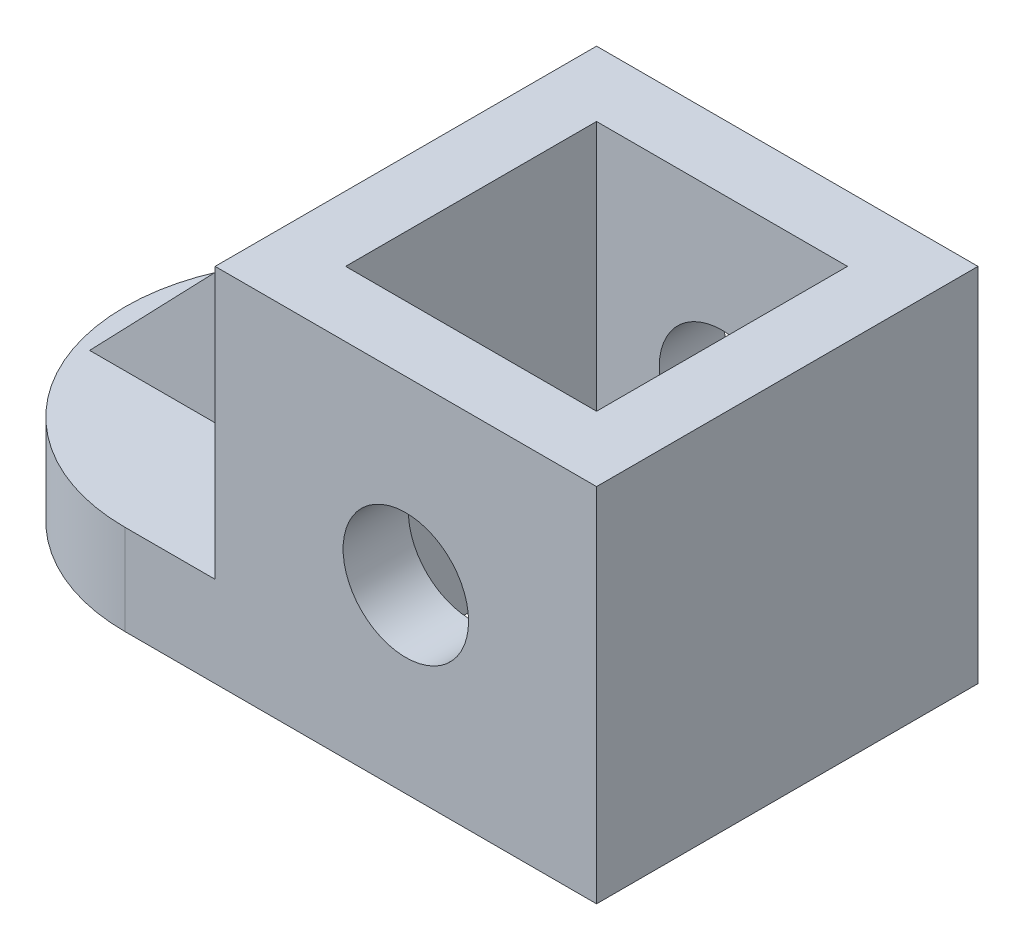
ISO-10303-21;
HEADER;
FILE_DESCRIPTION(('STEP AP214'),'2;1');
FILE_NAME('part.step','',(''),(''),'','','');
FILE_SCHEMA(('AUTOMOTIVE_DESIGN { 1 0 10303 214 1 1 1 1 }'));
ENDSEC;
DATA;
#1=APPLICATION_CONTEXT('core data for automotive mechanical design processes');
#2=APPLICATION_PROTOCOL_DEFINITION('international standard','automotive_design',2000,#1);
#3=PRODUCT_CONTEXT('',#1,'mechanical');
#4=PRODUCT('Part','Part','',(#3));
#5=PRODUCT_RELATED_PRODUCT_CATEGORY('part','',(#4));
#6=PRODUCT_DEFINITION_FORMATION('','',#4);
#7=PRODUCT_DEFINITION_CONTEXT('part definition',#1,'design');
#8=PRODUCT_DEFINITION('design','',#6,#7);
#9=PRODUCT_DEFINITION_SHAPE('','',#8);
#10=(LENGTH_UNIT() NAMED_UNIT(*) SI_UNIT(.MILLI.,.METRE.));
#11=(NAMED_UNIT(*) PLANE_ANGLE_UNIT() SI_UNIT($,.RADIAN.));
#12=(NAMED_UNIT(*) SI_UNIT($,.STERADIAN.) SOLID_ANGLE_UNIT());
#13=UNCERTAINTY_MEASURE_WITH_UNIT(LENGTH_MEASURE(1.E-05),#10,'distance_accuracy_value','');
#14=(GEOMETRIC_REPRESENTATION_CONTEXT(3) GLOBAL_UNCERTAINTY_ASSIGNED_CONTEXT((#13)) GLOBAL_UNIT_ASSIGNED_CONTEXT((#10,
#11,#12)) REPRESENTATION_CONTEXT('',''));
#15=CARTESIAN_POINT('',(0.,0.,0.));
#16=DIRECTION('',(0.,0.,1.));
#17=DIRECTION('',(1.,0.,0.));
#18=AXIS2_PLACEMENT_3D('',#15,#16,#17);
#19=CARTESIAN_POINT('',(-185.934081035944,55.9356148241855,76.));
#20=DIRECTION('',(1.,0.,0.));
#21=DIRECTION('',(0.,0.,-1.));
#22=AXIS2_PLACEMENT_3D('',#19,#20,#21);
#23=PLANE('',#22);
#24=DIRECTION('',(0.,-1.,0.));
#25=VECTOR('',#24,1.);
#26=CARTESIAN_POINT('',(-185.934081035944,55.9356148241855,27.));
#27=LINE('',#26,#25);
#28=CARTESIAN_POINT('',(-185.934081035944,55.9356148241855,27.));
#29=VERTEX_POINT('',#28);
#30=CARTESIAN_POINT('',(-185.934081035944,1.93561482418547,27.));
#31=VERTEX_POINT('',#30);
#32=EDGE_CURVE('E160',#29,#31,#27,.T.);
#33=ORIENTED_EDGE('',*,*,#32,.F.);
#34=DIRECTION('',(0.,0.,-1.));
#35=VECTOR('',#34,1.);
#36=CARTESIAN_POINT('',(-185.934081035944,55.9356148241855,76.));
#37=LINE('',#36,#35);
#38=CARTESIAN_POINT('',(-185.934081035944,55.9356148241855,0.));
#39=VERTEX_POINT('',#38);
#40=EDGE_CURVE('E142',#29,#39,#37,.T.);
#41=ORIENTED_EDGE('',*,*,#40,.T.);
#42=DIRECTION('',(0.,-1.,0.));
#43=VECTOR('',#42,1.);
#44=CARTESIAN_POINT('',(-185.934081035944,55.9356148241855,0.));
#45=LINE('',#44,#43);
#46=CARTESIAN_POINT('',(-185.934081035944,1.93561482418547,0.));
#47=VERTEX_POINT('',#46);
#48=EDGE_CURVE('E234',#39,#47,#45,.T.);
#49=ORIENTED_EDGE('',*,*,#48,.T.);
#50=DIRECTION('',(0.,0.,-1.));
#51=VECTOR('',#50,1.);
#52=CARTESIAN_POINT('',(-185.934081035944,1.93561482418547,76.));
#53=LINE('',#52,#51);
#54=EDGE_CURVE('E161',#31,#47,#53,.T.);
#55=ORIENTED_EDGE('',*,*,#54,.F.);
#56=EDGE_LOOP('',(#33,#41,#49,#55));
#57=FACE_BOUND('',#56,.T.);
#58=ADVANCED_FACE('F47',(#57),#23,.F.);
#59=CARTESIAN_POINT('',(-203.934081035944,1.93561482418547,38.));
#60=DIRECTION('',(0.,-1.,0.));
#61=DIRECTION('',(0.,0.,-1.));
#62=AXIS2_PLACEMENT_3D('',#59,#60,#61);
#63=CYLINDRICAL_SURFACE('',#62,38.);
#64=DIRECTION('',(0.,1.,0.));
#65=VECTOR('',#64,1.);
#66=CARTESIAN_POINT('',(-203.934081035944,1.93561482418547,0.));
#67=LINE('',#66,#65);
#68=CARTESIAN_POINT('',(-203.934081035944,-16.0643851758145,0.));
#69=VERTEX_POINT('',#68);
#70=CARTESIAN_POINT('',(-203.934081035944,1.93561482418547,0.));
#71=VERTEX_POINT('',#70);
#72=EDGE_CURVE('E291',#69,#71,#67,.T.);
#73=ORIENTED_EDGE('',*,*,#72,.F.);
#74=CARTESIAN_POINT('',(-203.934081035944,-16.0643851758145,38.));
#75=DIRECTION('',(0.,1.,0.));
#76=DIRECTION('',(-1.,0.,0.));
#77=AXIS2_PLACEMENT_3D('',#74,#75,#76);
#78=CIRCLE('',#77,38.);
#79=CARTESIAN_POINT('',(-203.934081035944,-16.0643851758145,76.));
#80=VERTEX_POINT('',#79);
#81=EDGE_CURVE('E11',#80,#69,#78,.F.);
#82=ORIENTED_EDGE('',*,*,#81,.F.);
#83=DIRECTION('',(0.,-1.,0.));
#84=VECTOR('',#83,1.);
#85=CARTESIAN_POINT('',(-203.934081035944,0.,76.));
#86=LINE('',#85,#84);
#87=CARTESIAN_POINT('',(-203.934081035944,1.93561482418547,76.));
#88=VERTEX_POINT('',#87);
#89=EDGE_CURVE('E287',#88,#80,#86,.T.);
#90=ORIENTED_EDGE('',*,*,#89,.F.);
#91=CARTESIAN_POINT('',(-203.934081035944,1.93561482418547,38.));
#92=DIRECTION('',(0.,-1.,0.));
#93=DIRECTION('',(1.,0.,0.));
#94=AXIS2_PLACEMENT_3D('',#91,#92,#93);
#95=CIRCLE('',#94,38.);
#96=EDGE_CURVE('E58',#71,#88,#95,.F.);
#97=ORIENTED_EDGE('',*,*,#96,.F.);
#98=EDGE_LOOP('',(#73,#82,#90,#97));
#99=FACE_BOUND('',#98,.T.);
#100=ADVANCED_FACE('F50',(#99),#63,.T.);
#101=CARTESIAN_POINT('',(-185.934081035944,55.9356148241855,76.));
#102=VERTEX_POINT('',#101);
#103=CARTESIAN_POINT('',(-185.934081035944,55.9356148241855,49.));
#104=VERTEX_POINT('',#103);
#105=EDGE_CURVE('E157',#102,#104,#37,.T.);
#106=ORIENTED_EDGE('',*,*,#105,.T.);
#107=DIRECTION('',(0.,-1.,0.));
#108=VECTOR('',#107,1.);
#109=CARTESIAN_POINT('',(-185.934081035944,55.9356148241855,49.));
#110=LINE('',#109,#108);
#111=CARTESIAN_POINT('',(-185.934081035944,1.93561482418547,49.));
#112=VERTEX_POINT('',#111);
#113=EDGE_CURVE('E183',#104,#112,#110,.T.);
#114=ORIENTED_EDGE('',*,*,#113,.T.);
#115=CARTESIAN_POINT('',(-185.934081035944,1.93561482418547,76.));
#116=VERTEX_POINT('',#115);
#117=EDGE_CURVE('E284',#116,#112,#53,.T.);
#118=ORIENTED_EDGE('',*,*,#117,.F.);
#119=DIRECTION('',(0.,-1.,0.));
#120=VECTOR('',#119,1.);
#121=CARTESIAN_POINT('',(-185.934081035944,55.9356148241855,76.));
#122=LINE('',#121,#120);
#123=EDGE_CURVE('E245',#102,#116,#122,.T.);
#124=ORIENTED_EDGE('',*,*,#123,.F.);
#125=EDGE_LOOP('',(#106,#114,#118,#124));
#126=FACE_BOUND('',#125,.T.);
#127=ADVANCED_FACE('F308',(#126),#23,.F.);
#128=CARTESIAN_POINT('',(-185.934081035944,1.93561482418547,76.));
#129=DIRECTION('',(0.,-1.,0.));
#130=DIRECTION('',(1.,0.,0.));
#131=AXIS2_PLACEMENT_3D('',#128,#129,#130);
#132=PLANE('',#131);
#133=ORIENTED_EDGE('',*,*,#117,.T.);
#134=DIRECTION('',(-1.,0.,0.));
#135=VECTOR('',#134,1.);
#136=CARTESIAN_POINT('',(-185.934081035944,1.93561482418547,49.));
#137=LINE('',#136,#135);
#138=CARTESIAN_POINT('',(-237.934081035944,1.93561482418546,49.));
#139=VERTEX_POINT('',#138);
#140=EDGE_CURVE('E65',#112,#139,#137,.T.);
#141=ORIENTED_EDGE('',*,*,#140,.T.);
#142=DIRECTION('',(0.,0.,-1.));
#143=VECTOR('',#142,1.);
#144=CARTESIAN_POINT('',(-237.934081035944,1.93561482418546,76.));
#145=LINE('',#144,#143);
#146=CARTESIAN_POINT('',(-237.934081035944,1.93561482418546,27.));
#147=VERTEX_POINT('',#146);
#148=EDGE_CURVE('E69',#139,#147,#145,.T.);
#149=ORIENTED_EDGE('',*,*,#148,.T.);
#150=DIRECTION('',(-1.,0.,0.));
#151=VECTOR('',#150,1.);
#152=CARTESIAN_POINT('',(-185.934081035944,1.93561482418547,27.));
#153=LINE('',#152,#151);
#154=EDGE_CURVE('E165',#31,#147,#153,.T.);
#155=ORIENTED_EDGE('',*,*,#154,.F.);
#156=ORIENTED_EDGE('',*,*,#54,.T.);
#157=DIRECTION('',(-1.,0.,0.));
#158=VECTOR('',#157,1.);
#159=CARTESIAN_POINT('',(-185.934081035944,1.93561482418547,0.));
#160=LINE('',#159,#158);
#161=EDGE_CURVE('E263',#47,#71,#160,.T.);
#162=ORIENTED_EDGE('',*,*,#161,.T.);
#163=ORIENTED_EDGE('',*,*,#96,.T.);
#164=DIRECTION('',(-1.,0.,0.));
#165=VECTOR('',#164,1.);
#166=CARTESIAN_POINT('',(-185.934081035944,1.93561482418547,76.));
#167=LINE('',#166,#165);
#168=EDGE_CURVE('E249',#116,#88,#167,.T.);
#169=ORIENTED_EDGE('',*,*,#168,.F.);
#170=EDGE_LOOP('',(#133,#141,#149,#155,#156,#162,#163,#169));
#171=FACE_BOUND('',#170,.T.);
#172=ADVANCED_FACE('F297',(#171),#132,.F.);
#173=CARTESIAN_POINT('',(-109.934081035944,-16.0643851758145,76.));
#174=DIRECTION('',(0.,1.,0.));
#175=DIRECTION('',(-1.,0.,0.));
#176=AXIS2_PLACEMENT_3D('',#173,#174,#175);
#177=PLANE('',#176);
#178=DIRECTION('',(0.,0.,1.));
#179=VECTOR('',#178,1.);
#180=CARTESIAN_POINT('',(-172.934081035944,-16.0643851758145,13.));
#181=LINE('',#180,#179);
#182=CARTESIAN_POINT('',(-172.934081035944,-16.0643851758145,13.));
#183=VERTEX_POINT('',#182);
#184=CARTESIAN_POINT('',(-172.934081035944,-16.0643851758145,63.));
#185=VERTEX_POINT('',#184);
#186=EDGE_CURVE('E203',#183,#185,#181,.T.);
#187=ORIENTED_EDGE('',*,*,#186,.T.);
#188=DIRECTION('',(1.,0.,0.));
#189=VECTOR('',#188,1.);
#190=CARTESIAN_POINT('',(-172.934081035944,-16.0643851758145,63.));
#191=LINE('',#190,#189);
#192=CARTESIAN_POINT('',(-122.934081035944,-16.0643851758145,63.));
#193=VERTEX_POINT('',#192);
#194=EDGE_CURVE('E206',#185,#193,#191,.T.);
#195=ORIENTED_EDGE('',*,*,#194,.T.);
#196=DIRECTION('',(0.,0.,-1.));
#197=VECTOR('',#196,1.);
#198=CARTESIAN_POINT('',(-122.934081035944,-16.0643851758145,13.));
#199=LINE('',#198,#197);
#200=CARTESIAN_POINT('',(-122.934081035944,-16.0643851758145,13.));
#201=VERTEX_POINT('',#200);
#202=EDGE_CURVE('E211',#193,#201,#199,.T.);
#203=ORIENTED_EDGE('',*,*,#202,.T.);
#204=DIRECTION('',(-1.,0.,0.));
#205=VECTOR('',#204,1.);
#206=CARTESIAN_POINT('',(-172.934081035944,-16.0643851758145,13.));
#207=LINE('',#206,#205);
#208=EDGE_CURVE('E214',#201,#183,#207,.T.);
#209=ORIENTED_EDGE('',*,*,#208,.T.);
#210=EDGE_LOOP('',(#187,#195,#203,#209));
#211=FACE_BOUND('',#210,.T.);
#212=ORIENTED_EDGE('',*,*,#81,.T.);
#213=DIRECTION('',(1.,0.,0.));
#214=VECTOR('',#213,1.);
#215=CARTESIAN_POINT('',(-109.934081035944,-16.0643851758145,0.));
#216=LINE('',#215,#214);
#217=CARTESIAN_POINT('',(-109.934081035944,-16.0643851758145,0.));
#218=VERTEX_POINT('',#217);
#219=EDGE_CURVE('E267',#69,#218,#216,.T.);
#220=ORIENTED_EDGE('',*,*,#219,.T.);
#221=DIRECTION('',(0.,0.,-1.));
#222=VECTOR('',#221,1.);
#223=CARTESIAN_POINT('',(-109.934081035944,-16.0643851758145,76.));
#224=LINE('',#223,#222);
#225=CARTESIAN_POINT('',(-109.934081035944,-16.0643851758145,76.));
#226=VERTEX_POINT('',#225);
#227=EDGE_CURVE('E281',#226,#218,#224,.T.);
#228=ORIENTED_EDGE('',*,*,#227,.F.);
#229=DIRECTION('',(1.,0.,0.));
#230=VECTOR('',#229,1.);
#231=CARTESIAN_POINT('',(-109.934081035944,-16.0643851758145,76.));
#232=LINE('',#231,#230);
#233=EDGE_CURVE('E253',#80,#226,#232,.T.);
#234=ORIENTED_EDGE('',*,*,#233,.F.);
#235=EDGE_LOOP('',(#212,#220,#228,#234));
#236=FACE_BOUND('',#235,.T.);
#237=ADVANCED_FACE('F331',(#211,#236),#177,.F.);
#238=CARTESIAN_POINT('',(-109.934081035944,55.9356148241855,76.));
#239=DIRECTION('',(-1.,0.,0.));
#240=DIRECTION('',(0.,0.,1.));
#241=AXIS2_PLACEMENT_3D('',#238,#239,#240);
#242=PLANE('',#241);
#243=ORIENTED_EDGE('',*,*,#227,.T.);
#244=DIRECTION('',(0.,1.,0.));
#245=VECTOR('',#244,1.);
#246=CARTESIAN_POINT('',(-109.934081035944,55.9356148241855,0.));
#247=LINE('',#246,#245);
#248=CARTESIAN_POINT('',(-109.934081035944,55.9356148241855,0.));
#249=VERTEX_POINT('',#248);
#250=EDGE_CURVE('E271',#218,#249,#247,.T.);
#251=ORIENTED_EDGE('',*,*,#250,.T.);
#252=DIRECTION('',(0.,0.,-1.));
#253=VECTOR('',#252,1.);
#254=CARTESIAN_POINT('',(-109.934081035944,55.9356148241855,76.));
#255=LINE('',#254,#253);
#256=CARTESIAN_POINT('',(-109.934081035944,55.9356148241855,76.));
#257=VERTEX_POINT('',#256);
#258=EDGE_CURVE('E278',#257,#249,#255,.T.);
#259=ORIENTED_EDGE('',*,*,#258,.F.);
#260=DIRECTION('',(0.,1.,0.));
#261=VECTOR('',#260,1.);
#262=CARTESIAN_POINT('',(-109.934081035944,55.9356148241855,76.));
#263=LINE('',#262,#261);
#264=EDGE_CURVE('E256',#226,#257,#263,.T.);
#265=ORIENTED_EDGE('',*,*,#264,.F.);
#266=EDGE_LOOP('',(#243,#251,#259,#265));
#267=FACE_BOUND('',#266,.T.);
#268=ADVANCED_FACE('F335',(#267),#242,.F.);
#269=CARTESIAN_POINT('',(-185.934081035944,55.9356148241855,76.));
#270=DIRECTION('',(0.,-1.,0.));
#271=DIRECTION('',(1.,0.,0.));
#272=AXIS2_PLACEMENT_3D('',#269,#270,#271);
#273=PLANE('',#272);
#274=DIRECTION('',(-1.,0.,0.));
#275=VECTOR('',#274,1.);
#276=CARTESIAN_POINT('',(-172.934081035944,55.9356148241855,13.));
#277=LINE('',#276,#275);
#278=CARTESIAN_POINT('',(-122.934081035944,55.9356148241855,13.));
#279=VERTEX_POINT('',#278);
#280=CARTESIAN_POINT('',(-172.934081035944,55.9356148241855,13.));
#281=VERTEX_POINT('',#280);
#282=EDGE_CURVE('E207',#279,#281,#277,.T.);
#283=ORIENTED_EDGE('',*,*,#282,.F.);
#284=DIRECTION('',(0.,0.,-1.));
#285=VECTOR('',#284,1.);
#286=CARTESIAN_POINT('',(-122.934081035944,55.9356148241855,13.));
#287=LINE('',#286,#285);
#288=CARTESIAN_POINT('',(-122.934081035944,55.9356148241855,63.));
#289=VERTEX_POINT('',#288);
#290=EDGE_CURVE('E225',#289,#279,#287,.T.);
#291=ORIENTED_EDGE('',*,*,#290,.F.);
#292=DIRECTION('',(1.,0.,0.));
#293=VECTOR('',#292,1.);
#294=CARTESIAN_POINT('',(-172.934081035944,55.9356148241855,63.));
#295=LINE('',#294,#293);
#296=CARTESIAN_POINT('',(-172.934081035944,55.9356148241855,63.));
#297=VERTEX_POINT('',#296);
#298=EDGE_CURVE('E221',#297,#289,#295,.T.);
#299=ORIENTED_EDGE('',*,*,#298,.F.);
#300=DIRECTION('',(0.,0.,1.));
#301=VECTOR('',#300,1.);
#302=CARTESIAN_POINT('',(-172.934081035944,55.9356148241855,13.));
#303=LINE('',#302,#301);
#304=EDGE_CURVE('E202',#281,#297,#303,.T.);
#305=ORIENTED_EDGE('',*,*,#304,.F.);
#306=EDGE_LOOP('',(#283,#291,#299,#305));
#307=FACE_BOUND('',#306,.T.);
#308=ORIENTED_EDGE('',*,*,#258,.T.);
#309=DIRECTION('',(-1.,0.,0.));
#310=VECTOR('',#309,1.);
#311=CARTESIAN_POINT('',(-185.934081035944,55.9356148241855,0.));
#312=LINE('',#311,#310);
#313=EDGE_CURVE('E150',#249,#39,#312,.T.);
#314=ORIENTED_EDGE('',*,*,#313,.T.);
#315=ORIENTED_EDGE('',*,*,#40,.F.);
#316=EDGE_CURVE('E147',#104,#29,#37,.T.);
#317=ORIENTED_EDGE('',*,*,#316,.F.);
#318=ORIENTED_EDGE('',*,*,#105,.F.);
#319=DIRECTION('',(-1.,0.,0.));
#320=VECTOR('',#319,1.);
#321=CARTESIAN_POINT('',(-185.934081035944,55.9356148241855,76.));
#322=LINE('',#321,#320);
#323=EDGE_CURVE('E155',#257,#102,#322,.T.);
#324=ORIENTED_EDGE('',*,*,#323,.F.);
#325=EDGE_LOOP('',(#308,#314,#315,#317,#318,#324));
#326=FACE_BOUND('',#325,.T.);
#327=ADVANCED_FACE('F144',(#307,#326),#273,.F.);
#328=CARTESIAN_POINT('',(0.,0.,76.));
#329=DIRECTION('',(0.,0.,-1.));
#330=DIRECTION('',(-1.,0.,0.));
#331=AXIS2_PLACEMENT_3D('',#328,#329,#330);
#332=PLANE('',#331);
#333=CARTESIAN_POINT('',(-147.934081035944,19.9356148241855,76.));
#334=DIRECTION('',(0.,0.,1.));
#335=DIRECTION('',(1.,0.,0.));
#336=AXIS2_PLACEMENT_3D('',#333,#334,#335);
#337=CIRCLE('',#336,12.5);
#338=CARTESIAN_POINT('',(-135.434081035944,19.9356148241855,76.));
#339=VERTEX_POINT('',#338);
#340=EDGE_CURVE('E190',#339,#339,#337,.T.);
#341=ORIENTED_EDGE('',*,*,#340,.F.);
#342=EDGE_LOOP('',(#341));
#343=FACE_BOUND('',#342,.T.);
#344=ORIENTED_EDGE('',*,*,#168,.T.);
#345=ORIENTED_EDGE('',*,*,#89,.T.);
#346=ORIENTED_EDGE('',*,*,#233,.T.);
#347=ORIENTED_EDGE('',*,*,#264,.T.);
#348=ORIENTED_EDGE('',*,*,#323,.T.);
#349=ORIENTED_EDGE('',*,*,#123,.T.);
#350=EDGE_LOOP('',(#344,#345,#346,#347,#348,#349));
#351=FACE_BOUND('',#350,.T.);
#352=ADVANCED_FACE('F303',(#343,#351),#332,.F.);
#353=CARTESIAN_POINT('',(0.,0.,0.));
#354=DIRECTION('',(0.,0.,-1.));
#355=DIRECTION('',(-1.,0.,0.));
#356=AXIS2_PLACEMENT_3D('',#353,#354,#355);
#357=PLANE('',#356);
#358=CARTESIAN_POINT('',(-147.934081035944,19.9356148241855,0.));
#359=DIRECTION('',(0.,0.,1.));
#360=DIRECTION('',(1.,0.,0.));
#361=AXIS2_PLACEMENT_3D('',#358,#359,#360);
#362=CIRCLE('',#361,12.5);
#363=CARTESIAN_POINT('',(-135.434081035944,19.9356148241855,0.));
#364=VERTEX_POINT('',#363);
#365=EDGE_CURVE('E191',#364,#364,#362,.T.);
#366=ORIENTED_EDGE('',*,*,#365,.T.);
#367=EDGE_LOOP('',(#366));
#368=FACE_BOUND('',#367,.T.);
#369=ORIENTED_EDGE('',*,*,#219,.F.);
#370=ORIENTED_EDGE('',*,*,#72,.T.);
#371=ORIENTED_EDGE('',*,*,#161,.F.);
#372=ORIENTED_EDGE('',*,*,#48,.F.);
#373=ORIENTED_EDGE('',*,*,#313,.F.);
#374=ORIENTED_EDGE('',*,*,#250,.F.);
#375=EDGE_LOOP('',(#369,#370,#371,#372,#373,#374));
#376=FACE_BOUND('',#375,.T.);
#377=ADVANCED_FACE('F345',(#368,#376),#357,.T.);
#378=CARTESIAN_POINT('',(-172.934081035944,-16.0643851758145,13.));
#379=DIRECTION('',(-1.,0.,0.));
#380=DIRECTION('',(0.,-1.,0.));
#381=AXIS2_PLACEMENT_3D('',#378,#379,#380);
#382=PLANE('',#381);
#383=DIRECTION('',(0.,1.,0.));
#384=VECTOR('',#383,1.);
#385=CARTESIAN_POINT('',(-172.934081035944,-16.0643851758145,63.));
#386=LINE('',#385,#384);
#387=EDGE_CURVE('E218',#185,#297,#386,.T.);
#388=ORIENTED_EDGE('',*,*,#387,.F.);
#389=ORIENTED_EDGE('',*,*,#186,.F.);
#390=DIRECTION('',(0.,1.,0.));
#391=VECTOR('',#390,1.);
#392=CARTESIAN_POINT('',(-172.934081035944,-16.0643851758145,13.));
#393=LINE('',#392,#391);
#394=EDGE_CURVE('E231',#183,#281,#393,.T.);
#395=ORIENTED_EDGE('',*,*,#394,.T.);
#396=ORIENTED_EDGE('',*,*,#304,.T.);
#397=EDGE_LOOP('',(#388,#389,#395,#396));
#398=FACE_BOUND('',#397,.T.);
#399=ADVANCED_FACE('F348',(#398),#382,.F.);
#400=CARTESIAN_POINT('',(-172.934081035944,-16.0643851758145,13.));
#401=DIRECTION('',(0.,0.,-1.));
#402=DIRECTION('',(-1.,0.,0.));
#403=AXIS2_PLACEMENT_3D('',#400,#401,#402);
#404=PLANE('',#403);
#405=CARTESIAN_POINT('',(-147.934081035944,19.9356148241855,13.));
#406=DIRECTION('',(0.,0.,-1.));
#407=DIRECTION('',(-1.,0.,0.));
#408=AXIS2_PLACEMENT_3D('',#405,#406,#407);
#409=CIRCLE('',#408,12.5);
#410=CARTESIAN_POINT('',(-160.434081035944,19.9356148241855,13.));
#411=VERTEX_POINT('',#410);
#412=EDGE_CURVE('E198',#411,#411,#409,.T.);
#413=ORIENTED_EDGE('',*,*,#412,.T.);
#414=EDGE_LOOP('',(#413));
#415=FACE_BOUND('',#414,.T.);
#416=ORIENTED_EDGE('',*,*,#282,.T.);
#417=ORIENTED_EDGE('',*,*,#394,.F.);
#418=ORIENTED_EDGE('',*,*,#208,.F.);
#419=DIRECTION('',(0.,1.,0.));
#420=VECTOR('',#419,1.);
#421=CARTESIAN_POINT('',(-122.934081035944,-16.0643851758145,13.));
#422=LINE('',#421,#420);
#423=EDGE_CURVE('E235',#201,#279,#422,.T.);
#424=ORIENTED_EDGE('',*,*,#423,.T.);
#425=EDGE_LOOP('',(#416,#417,#418,#424));
#426=FACE_BOUND('',#425,.T.);
#427=ADVANCED_FACE('F355',(#415,#426),#404,.F.);
#428=CARTESIAN_POINT('',(-122.934081035944,-16.0643851758145,13.));
#429=DIRECTION('',(1.,0.,0.));
#430=DIRECTION('',(0.,0.,-1.));
#431=AXIS2_PLACEMENT_3D('',#428,#429,#430);
#432=PLANE('',#431);
#433=ORIENTED_EDGE('',*,*,#290,.T.);
#434=ORIENTED_EDGE('',*,*,#423,.F.);
#435=ORIENTED_EDGE('',*,*,#202,.F.);
#436=DIRECTION('',(0.,1.,0.));
#437=VECTOR('',#436,1.);
#438=CARTESIAN_POINT('',(-122.934081035944,-16.0643851758145,63.));
#439=LINE('',#438,#437);
#440=EDGE_CURVE('E239',#193,#289,#439,.T.);
#441=ORIENTED_EDGE('',*,*,#440,.T.);
#442=EDGE_LOOP('',(#433,#434,#435,#441));
#443=FACE_BOUND('',#442,.T.);
#444=ADVANCED_FACE('F361',(#443),#432,.F.);
#445=CARTESIAN_POINT('',(-172.934081035944,-16.0643851758145,63.));
#446=DIRECTION('',(0.,0.,1.));
#447=DIRECTION('',(1.,0.,0.));
#448=AXIS2_PLACEMENT_3D('',#445,#446,#447);
#449=PLANE('',#448);
#450=CARTESIAN_POINT('',(-147.934081035944,19.9356148241855,63.));
#451=DIRECTION('',(0.,0.,1.));
#452=DIRECTION('',(1.,0.,0.));
#453=AXIS2_PLACEMENT_3D('',#450,#451,#452);
#454=CIRCLE('',#453,12.5);
#455=CARTESIAN_POINT('',(-135.434081035944,19.9356148241855,63.));
#456=VERTEX_POINT('',#455);
#457=EDGE_CURVE('E52',#456,#456,#454,.T.);
#458=ORIENTED_EDGE('',*,*,#457,.T.);
#459=EDGE_LOOP('',(#458));
#460=FACE_BOUND('',#459,.T.);
#461=ORIENTED_EDGE('',*,*,#298,.T.);
#462=ORIENTED_EDGE('',*,*,#440,.F.);
#463=ORIENTED_EDGE('',*,*,#194,.F.);
#464=ORIENTED_EDGE('',*,*,#387,.T.);
#465=EDGE_LOOP('',(#461,#462,#463,#464));
#466=FACE_BOUND('',#465,.T.);
#467=ADVANCED_FACE('F357',(#460,#466),#449,.F.);
#468=CARTESIAN_POINT('',(-147.934081035944,19.9356148241855,0.));
#469=DIRECTION('',(0.,0.,1.));
#470=DIRECTION('',(1.,0.,0.));
#471=AXIS2_PLACEMENT_3D('',#468,#469,#470);
#472=CYLINDRICAL_SURFACE('',#471,12.5);
#473=ORIENTED_EDGE('',*,*,#340,.T.);
#474=EDGE_LOOP('',(#473));
#475=FACE_BOUND('',#474,.T.);
#476=ORIENTED_EDGE('',*,*,#457,.F.);
#477=EDGE_LOOP('',(#476));
#478=FACE_BOUND('',#477,.T.);
#479=ADVANCED_FACE('F360',(#475,#478),#472,.F.);
#480=ORIENTED_EDGE('',*,*,#365,.F.);
#481=EDGE_LOOP('',(#480));
#482=FACE_BOUND('',#481,.T.);
#483=ORIENTED_EDGE('',*,*,#412,.F.);
#484=EDGE_LOOP('',(#483));
#485=FACE_BOUND('',#484,.T.);
#486=ADVANCED_FACE('F319',(#482,#485),#472,.F.);
#487=CARTESIAN_POINT('',(-185.934081035944,55.9356148241855,38.));
#488=DIRECTION('',(-0.720320213491481,0.693641687065871,0.));
#489=DIRECTION('',(-0.693641687065871,-0.720320213491481,0.));
#490=AXIS2_PLACEMENT_3D('',#487,#488,#489);
#491=PLANE('',#490);
#492=ORIENTED_EDGE('',*,*,#148,.F.);
#493=DIRECTION('',(-0.693641687065871,-0.720320213491481,0.));
#494=VECTOR('',#493,1.);
#495=CARTESIAN_POINT('',(-185.934081035944,55.9356148241855,49.));
#496=LINE('',#495,#494);
#497=EDGE_CURVE('E166',#104,#139,#496,.T.);
#498=ORIENTED_EDGE('',*,*,#497,.F.);
#499=ORIENTED_EDGE('',*,*,#316,.T.);
#500=DIRECTION('',(-0.693641687065871,-0.720320213491481,0.));
#501=VECTOR('',#500,1.);
#502=CARTESIAN_POINT('',(-185.934081035944,55.9356148241855,27.));
#503=LINE('',#502,#501);
#504=EDGE_CURVE('E172',#29,#147,#503,.T.);
#505=ORIENTED_EDGE('',*,*,#504,.T.);
#506=EDGE_LOOP('',(#492,#498,#499,#505));
#507=FACE_BOUND('',#506,.T.);
#508=ADVANCED_FACE('F171',(#507),#491,.T.);
#509=CARTESIAN_POINT('',(-175.934081035944,19.9356148241855,49.));
#510=DIRECTION('',(0.,0.,1.));
#511=DIRECTION('',(1.,0.,0.));
#512=AXIS2_PLACEMENT_3D('',#509,#510,#511);
#513=PLANE('',#512);
#514=ORIENTED_EDGE('',*,*,#140,.F.);
#515=ORIENTED_EDGE('',*,*,#113,.F.);
#516=ORIENTED_EDGE('',*,*,#497,.T.);
#517=EDGE_LOOP('',(#514,#515,#516));
#518=FACE_BOUND('',#517,.T.);
#519=ADVANCED_FACE('F311',(#518),#513,.T.);
#520=CARTESIAN_POINT('',(-175.934081035944,19.9356148241855,27.));
#521=DIRECTION('',(0.,0.,1.));
#522=DIRECTION('',(1.,0.,0.));
#523=AXIS2_PLACEMENT_3D('',#520,#521,#522);
#524=PLANE('',#523);
#525=ORIENTED_EDGE('',*,*,#32,.T.);
#526=ORIENTED_EDGE('',*,*,#154,.T.);
#527=ORIENTED_EDGE('',*,*,#504,.F.);
#528=EDGE_LOOP('',(#525,#526,#527));
#529=FACE_BOUND('',#528,.T.);
#530=ADVANCED_FACE('F175',(#529),#524,.F.);
#531=CLOSED_SHELL('',(#58,#100,#127,#172,#237,#268,#327,#352,#377,#399,#427,#444,#467,#479,#486,
#508,#519,#530));
#532=MANIFOLD_SOLID_BREP('B2',#531);
#533=ADVANCED_BREP_SHAPE_REPRESENTATION('',(#18,#532),#14);
#534=SHAPE_DEFINITION_REPRESENTATION(#9,#533);
ENDSEC;
END-ISO-10303-21;
